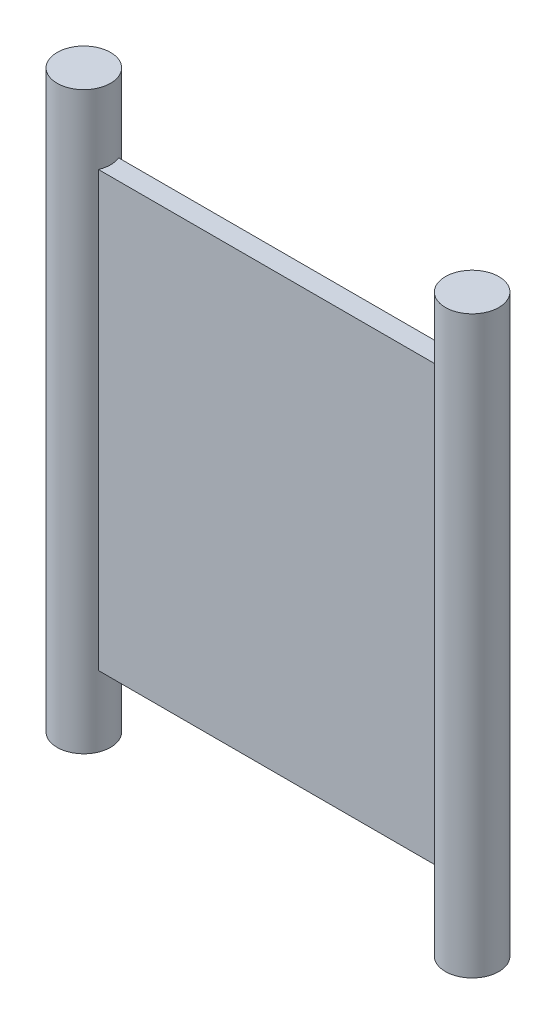
ISO-10303-21;
HEADER;
FILE_DESCRIPTION(('STEP AP214'),'2;1');
FILE_NAME('part.step','',(''),(''),'','','');
FILE_SCHEMA(('AUTOMOTIVE_DESIGN { 1 0 10303 214 1 1 1 1 }'));
ENDSEC;
DATA;
#1=APPLICATION_CONTEXT('core data for automotive mechanical design processes');
#2=APPLICATION_PROTOCOL_DEFINITION('international standard','automotive_design',2000,#1);
#3=PRODUCT_CONTEXT('',#1,'mechanical');
#4=PRODUCT('Part','Part','',(#3));
#5=PRODUCT_RELATED_PRODUCT_CATEGORY('part','',(#4));
#6=PRODUCT_DEFINITION_FORMATION('','',#4);
#7=PRODUCT_DEFINITION_CONTEXT('part definition',#1,'design');
#8=PRODUCT_DEFINITION('design','',#6,#7);
#9=PRODUCT_DEFINITION_SHAPE('','',#8);
#10=(LENGTH_UNIT() NAMED_UNIT(*) SI_UNIT(.MILLI.,.METRE.));
#11=(NAMED_UNIT(*) PLANE_ANGLE_UNIT() SI_UNIT($,.RADIAN.));
#12=(NAMED_UNIT(*) SI_UNIT($,.STERADIAN.) SOLID_ANGLE_UNIT());
#13=UNCERTAINTY_MEASURE_WITH_UNIT(LENGTH_MEASURE(1.E-05),#10,'distance_accuracy_value','');
#14=(GEOMETRIC_REPRESENTATION_CONTEXT(3) GLOBAL_UNCERTAINTY_ASSIGNED_CONTEXT((#13)) GLOBAL_UNIT_ASSIGNED_CONTEXT((#10,
#11,#12)) REPRESENTATION_CONTEXT('',''));
#15=CARTESIAN_POINT('',(0.,0.,0.));
#16=DIRECTION('',(0.,0.,1.));
#17=DIRECTION('',(1.,0.,0.));
#18=AXIS2_PLACEMENT_3D('',#15,#16,#17);
#19=CARTESIAN_POINT('',(9.62,21.5,0.499999999999999));
#20=DIRECTION('',(0.,0.,-1.));
#21=DIRECTION('',(-1.,0.,0.));
#22=AXIS2_PLACEMENT_3D('',#19,#20,#21);
#23=PLANE('',#22);
#24=DIRECTION('',(0.,-1.,0.));
#25=VECTOR('',#24,1.);
#26=CARTESIAN_POINT('',(8.39296088081919,25.,0.499999999999999));
#27=LINE('',#26,#25);
#28=CARTESIAN_POINT('',(8.39296088081919,21.5,0.499999999999999));
#29=VERTEX_POINT('',#28);
#30=CARTESIAN_POINT('',(8.39296088081919,0.,0.499999999999999));
#31=VERTEX_POINT('',#30);
#32=EDGE_CURVE('E53',#29,#31,#27,.T.);
#33=ORIENTED_EDGE('',*,*,#32,.F.);
#34=DIRECTION('',(1.,0.,0.));
#35=VECTOR('',#34,1.);
#36=CARTESIAN_POINT('',(9.62,21.5,0.499999999999999));
#37=LINE('',#36,#35);
#38=CARTESIAN_POINT('',(-8.3929608808192,21.5,0.500000000000001));
#39=VERTEX_POINT('',#38);
#40=EDGE_CURVE('E90',#39,#29,#37,.T.);
#41=ORIENTED_EDGE('',*,*,#40,.F.);
#42=DIRECTION('',(0.,-1.,0.));
#43=VECTOR('',#42,1.);
#44=CARTESIAN_POINT('',(-8.3929608808192,25.,0.500000000000001));
#45=LINE('',#44,#43);
#46=CARTESIAN_POINT('',(-8.3929608808192,0.,0.500000000000001));
#47=VERTEX_POINT('',#46);
#48=EDGE_CURVE('E103',#47,#39,#45,.F.);
#49=ORIENTED_EDGE('',*,*,#48,.F.);
#50=DIRECTION('',(1.,0.,0.));
#51=VECTOR('',#50,1.);
#52=CARTESIAN_POINT('',(9.62,0.,0.499999999999999));
#53=LINE('',#52,#51);
#54=EDGE_CURVE('E91',#47,#31,#53,.T.);
#55=ORIENTED_EDGE('',*,*,#54,.T.);
#56=EDGE_LOOP('',(#33,#41,#49,#55));
#57=FACE_BOUND('',#56,.T.);
#58=ADVANCED_FACE('F39',(#57),#23,.F.);
#59=CARTESIAN_POINT('',(9.62,21.5,-0.500000000000001));
#60=DIRECTION('',(0.,0.,1.));
#61=DIRECTION('',(1.,0.,0.));
#62=AXIS2_PLACEMENT_3D('',#59,#60,#61);
#63=PLANE('',#62);
#64=DIRECTION('',(0.,-1.,0.));
#65=VECTOR('',#64,1.);
#66=CARTESIAN_POINT('',(8.39296088081919,25.,-0.500000000000001));
#67=LINE('',#66,#65);
#68=CARTESIAN_POINT('',(8.39296088081919,0.,-0.500000000000001));
#69=VERTEX_POINT('',#68);
#70=CARTESIAN_POINT('',(8.39296088081919,21.5,-0.500000000000001));
#71=VERTEX_POINT('',#70);
#72=EDGE_CURVE('E78',#69,#71,#67,.F.);
#73=ORIENTED_EDGE('',*,*,#72,.F.);
#74=DIRECTION('',(-1.,0.,0.));
#75=VECTOR('',#74,1.);
#76=CARTESIAN_POINT('',(9.62,0.,-0.500000000000001));
#77=LINE('',#76,#75);
#78=CARTESIAN_POINT('',(-8.3929608808192,0.,-0.499999999999999));
#79=VERTEX_POINT('',#78);
#80=EDGE_CURVE('E60',#69,#79,#77,.T.);
#81=ORIENTED_EDGE('',*,*,#80,.T.);
#82=DIRECTION('',(0.,-1.,0.));
#83=VECTOR('',#82,1.);
#84=CARTESIAN_POINT('',(-8.3929608808192,25.,-0.499999999999999));
#85=LINE('',#84,#83);
#86=CARTESIAN_POINT('',(-8.3929608808192,21.5,-0.499999999999999));
#87=VERTEX_POINT('',#86);
#88=EDGE_CURVE('E105',#87,#79,#85,.T.);
#89=ORIENTED_EDGE('',*,*,#88,.F.);
#90=DIRECTION('',(-1.,0.,0.));
#91=VECTOR('',#90,1.);
#92=CARTESIAN_POINT('',(9.62,21.5,-0.500000000000001));
#93=LINE('',#92,#91);
#94=EDGE_CURVE('E85',#71,#87,#93,.T.);
#95=ORIENTED_EDGE('',*,*,#94,.F.);
#96=EDGE_LOOP('',(#73,#81,#89,#95));
#97=FACE_BOUND('',#96,.T.);
#98=ADVANCED_FACE('F84',(#97),#63,.F.);
#99=CARTESIAN_POINT('',(-9.62,25.,0.));
#100=DIRECTION('',(0.,-1.,0.));
#101=DIRECTION('',(0.,0.,-1.));
#102=AXIS2_PLACEMENT_3D('',#99,#100,#101);
#103=CYLINDRICAL_SURFACE('',#102,1.325);
#104=CARTESIAN_POINT('',(-9.62,25.,0.));
#105=DIRECTION('',(0.,1.,0.));
#106=DIRECTION('',(0.,0.,1.));
#107=AXIS2_PLACEMENT_3D('',#104,#105,#106);
#108=CIRCLE('',#107,1.325);
#109=CARTESIAN_POINT('',(-9.62,25.,1.325));
#110=VERTEX_POINT('',#109);
#111=EDGE_CURVE('E107',#110,#110,#108,.T.);
#112=ORIENTED_EDGE('',*,*,#111,.F.);
#113=EDGE_LOOP('',(#112));
#114=FACE_BOUND('',#113,.T.);
#115=CARTESIAN_POINT('',(-9.62,-3.5,0.));
#116=DIRECTION('',(0.,1.,0.));
#117=DIRECTION('',(0.,0.,1.));
#118=AXIS2_PLACEMENT_3D('',#115,#116,#117);
#119=CIRCLE('',#118,1.325);
#120=CARTESIAN_POINT('',(-9.62,-3.5,1.325));
#121=VERTEX_POINT('',#120);
#122=EDGE_CURVE('E108',#121,#121,#119,.T.);
#123=ORIENTED_EDGE('',*,*,#122,.T.);
#124=EDGE_LOOP('',(#123));
#125=FACE_BOUND('',#124,.T.);
#126=ORIENTED_EDGE('',*,*,#48,.T.);
#127=CARTESIAN_POINT('',(-9.62,21.5,0.));
#128=DIRECTION('',(0.,-1.,0.));
#129=DIRECTION('',(0.,0.,-1.));
#130=AXIS2_PLACEMENT_3D('',#127,#128,#129);
#131=CIRCLE('',#130,1.325);
#132=EDGE_CURVE('E95',#39,#87,#131,.F.);
#133=ORIENTED_EDGE('',*,*,#132,.T.);
#134=ORIENTED_EDGE('',*,*,#88,.T.);
#135=CARTESIAN_POINT('',(-9.62,0.,0.));
#136=DIRECTION('',(0.,-1.,0.));
#137=DIRECTION('',(0.,0.,-1.));
#138=AXIS2_PLACEMENT_3D('',#135,#136,#137);
#139=CIRCLE('',#138,1.325);
#140=EDGE_CURVE('E46',#47,#79,#139,.F.);
#141=ORIENTED_EDGE('',*,*,#140,.F.);
#142=EDGE_LOOP('',(#126,#133,#134,#141));
#143=FACE_BOUND('',#142,.T.);
#144=ADVANCED_FACE('F138',(#114,#125,#143),#103,.T.);
#145=CARTESIAN_POINT('',(-9.62,25.,0.));
#146=DIRECTION('',(0.,1.,0.));
#147=DIRECTION('',(0.,0.,1.));
#148=AXIS2_PLACEMENT_3D('',#145,#146,#147);
#149=PLANE('',#148);
#150=ORIENTED_EDGE('',*,*,#111,.T.);
#151=EDGE_LOOP('',(#150));
#152=FACE_BOUND('',#151,.T.);
#153=ADVANCED_FACE('F144',(#152),#149,.T.);
#154=CARTESIAN_POINT('',(-9.62,-3.5,0.));
#155=DIRECTION('',(0.,1.,0.));
#156=DIRECTION('',(0.,0.,1.));
#157=AXIS2_PLACEMENT_3D('',#154,#155,#156);
#158=PLANE('',#157);
#159=ORIENTED_EDGE('',*,*,#122,.F.);
#160=EDGE_LOOP('',(#159));
#161=FACE_BOUND('',#160,.T.);
#162=ADVANCED_FACE('F150',(#161),#158,.F.);
#163=CARTESIAN_POINT('',(0.,21.5,0.));
#164=DIRECTION('',(0.,-1.,0.));
#165=DIRECTION('',(0.,0.,-1.));
#166=AXIS2_PLACEMENT_3D('',#163,#164,#165);
#167=PLANE('',#166);
#168=CARTESIAN_POINT('',(9.62,21.5,0.));
#169=DIRECTION('',(0.,-1.,0.));
#170=DIRECTION('',(0.,0.,-1.));
#171=AXIS2_PLACEMENT_3D('',#168,#169,#170);
#172=CIRCLE('',#171,1.325);
#173=EDGE_CURVE('E111',#71,#29,#172,.F.);
#174=ORIENTED_EDGE('',*,*,#173,.F.);
#175=ORIENTED_EDGE('',*,*,#94,.T.);
#176=ORIENTED_EDGE('',*,*,#132,.F.);
#177=ORIENTED_EDGE('',*,*,#40,.T.);
#178=EDGE_LOOP('',(#174,#175,#176,#177));
#179=FACE_BOUND('',#178,.T.);
#180=ADVANCED_FACE('F141',(#179),#167,.F.);
#181=CARTESIAN_POINT('',(0.,0.,0.));
#182=DIRECTION('',(0.,-1.,0.));
#183=DIRECTION('',(0.,0.,-1.));
#184=AXIS2_PLACEMENT_3D('',#181,#182,#183);
#185=PLANE('',#184);
#186=ORIENTED_EDGE('',*,*,#80,.F.);
#187=CARTESIAN_POINT('',(9.62,0.,0.));
#188=DIRECTION('',(0.,-1.,0.));
#189=DIRECTION('',(0.,0.,-1.));
#190=AXIS2_PLACEMENT_3D('',#187,#188,#189);
#191=CIRCLE('',#190,1.325);
#192=EDGE_CURVE('E11',#69,#31,#191,.F.);
#193=ORIENTED_EDGE('',*,*,#192,.T.);
#194=ORIENTED_EDGE('',*,*,#54,.F.);
#195=ORIENTED_EDGE('',*,*,#140,.T.);
#196=EDGE_LOOP('',(#186,#193,#194,#195));
#197=FACE_BOUND('',#196,.T.);
#198=ADVANCED_FACE('F89',(#197),#185,.T.);
#199=CARTESIAN_POINT('',(9.62,25.,0.));
#200=DIRECTION('',(0.,-1.,0.));
#201=DIRECTION('',(0.,0.,-1.));
#202=AXIS2_PLACEMENT_3D('',#199,#200,#201);
#203=CYLINDRICAL_SURFACE('',#202,1.325);
#204=CARTESIAN_POINT('',(9.62,25.,0.));
#205=DIRECTION('',(0.,1.,0.));
#206=DIRECTION('',(0.,0.,1.));
#207=AXIS2_PLACEMENT_3D('',#204,#205,#206);
#208=CIRCLE('',#207,1.325);
#209=CARTESIAN_POINT('',(9.62,25.,1.325));
#210=VERTEX_POINT('',#209);
#211=EDGE_CURVE('E116',#210,#210,#208,.T.);
#212=ORIENTED_EDGE('',*,*,#211,.F.);
#213=EDGE_LOOP('',(#212));
#214=FACE_BOUND('',#213,.T.);
#215=CARTESIAN_POINT('',(9.62,-3.5,0.));
#216=DIRECTION('',(0.,1.,0.));
#217=DIRECTION('',(0.,0.,1.));
#218=AXIS2_PLACEMENT_3D('',#215,#216,#217);
#219=CIRCLE('',#218,1.325);
#220=CARTESIAN_POINT('',(9.62,-3.5,1.325));
#221=VERTEX_POINT('',#220);
#222=EDGE_CURVE('E86',#221,#221,#219,.T.);
#223=ORIENTED_EDGE('',*,*,#222,.T.);
#224=EDGE_LOOP('',(#223));
#225=FACE_BOUND('',#224,.T.);
#226=ORIENTED_EDGE('',*,*,#72,.T.);
#227=ORIENTED_EDGE('',*,*,#173,.T.);
#228=ORIENTED_EDGE('',*,*,#32,.T.);
#229=ORIENTED_EDGE('',*,*,#192,.F.);
#230=EDGE_LOOP('',(#226,#227,#228,#229));
#231=FACE_BOUND('',#230,.T.);
#232=ADVANCED_FACE('F77',(#214,#225,#231),#203,.T.);
#233=CARTESIAN_POINT('',(9.62,25.,0.));
#234=DIRECTION('',(0.,1.,0.));
#235=DIRECTION('',(0.,0.,1.));
#236=AXIS2_PLACEMENT_3D('',#233,#234,#235);
#237=PLANE('',#236);
#238=ORIENTED_EDGE('',*,*,#211,.T.);
#239=EDGE_LOOP('',(#238));
#240=FACE_BOUND('',#239,.T.);
#241=ADVANCED_FACE('F125',(#240),#237,.T.);
#242=CARTESIAN_POINT('',(9.62,-3.5,0.));
#243=DIRECTION('',(0.,1.,0.));
#244=DIRECTION('',(0.,0.,1.));
#245=AXIS2_PLACEMENT_3D('',#242,#243,#244);
#246=PLANE('',#245);
#247=ORIENTED_EDGE('',*,*,#222,.F.);
#248=EDGE_LOOP('',(#247));
#249=FACE_BOUND('',#248,.T.);
#250=ADVANCED_FACE('F123',(#249),#246,.F.);
#251=CLOSED_SHELL('',(#58,#98,#144,#153,#162,#180,#198,#232,#241,#250));
#252=MANIFOLD_SOLID_BREP('B2',#251);
#253=ADVANCED_BREP_SHAPE_REPRESENTATION('',(#18,#252),#14);
#254=SHAPE_DEFINITION_REPRESENTATION(#9,#253);
ENDSEC;
END-ISO-10303-21;
